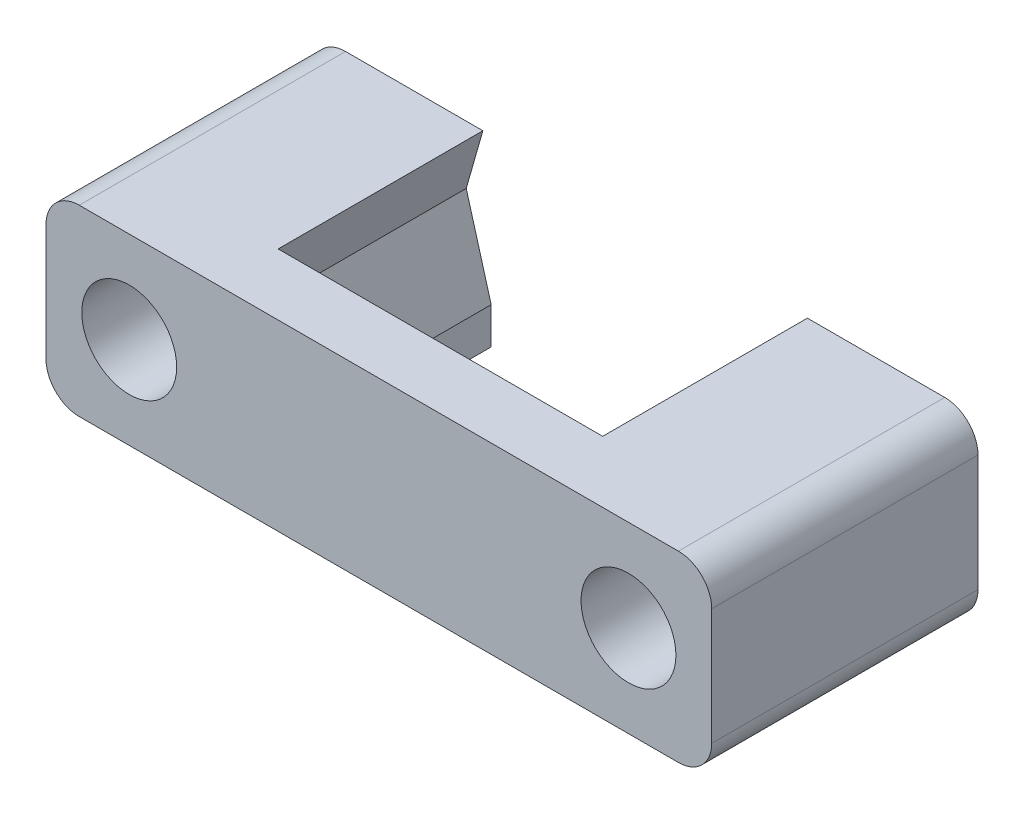
ISO-10303-21;
HEADER;
FILE_DESCRIPTION(('STEP AP214'),'2;1');
FILE_NAME('part.step','',(''),(''),'','','');
FILE_SCHEMA(('AUTOMOTIVE_DESIGN { 1 0 10303 214 1 1 1 1 }'));
ENDSEC;
DATA;
#1=APPLICATION_CONTEXT('core data for automotive mechanical design processes');
#2=APPLICATION_PROTOCOL_DEFINITION('international standard','automotive_design',2000,#1);
#3=PRODUCT_CONTEXT('',#1,'mechanical');
#4=PRODUCT('Part','Part','',(#3));
#5=PRODUCT_RELATED_PRODUCT_CATEGORY('part','',(#4));
#6=PRODUCT_DEFINITION_FORMATION('','',#4);
#7=PRODUCT_DEFINITION_CONTEXT('part definition',#1,'design');
#8=PRODUCT_DEFINITION('design','',#6,#7);
#9=PRODUCT_DEFINITION_SHAPE('','',#8);
#10=(LENGTH_UNIT() NAMED_UNIT(*) SI_UNIT(.MILLI.,.METRE.));
#11=(NAMED_UNIT(*) PLANE_ANGLE_UNIT() SI_UNIT($,.RADIAN.));
#12=(NAMED_UNIT(*) SI_UNIT($,.STERADIAN.) SOLID_ANGLE_UNIT());
#13=UNCERTAINTY_MEASURE_WITH_UNIT(LENGTH_MEASURE(1.E-05),#10,'distance_accuracy_value','');
#14=(GEOMETRIC_REPRESENTATION_CONTEXT(3) GLOBAL_UNCERTAINTY_ASSIGNED_CONTEXT((#13)) GLOBAL_UNIT_ASSIGNED_CONTEXT((#10,
#11,#12)) REPRESENTATION_CONTEXT('',''));
#15=CARTESIAN_POINT('',(0.,0.,0.));
#16=DIRECTION('',(0.,0.,1.));
#17=DIRECTION('',(1.,0.,0.));
#18=AXIS2_PLACEMENT_3D('',#15,#16,#17);
#19=CARTESIAN_POINT('',(5.,5.5,14.));
#20=DIRECTION('',(0.,0.,-1.));
#21=DIRECTION('',(-1.,0.,0.));
#22=AXIS2_PLACEMENT_3D('',#19,#20,#21);
#23=CYLINDRICAL_SURFACE('',#22,1.60000000000001);
#24=CARTESIAN_POINT('',(5.,5.5,9.));
#25=DIRECTION('',(0.,0.,1.));
#26=DIRECTION('',(1.,0.,0.));
#27=AXIS2_PLACEMENT_3D('',#24,#25,#26);
#28=CIRCLE('',#27,1.60000000000001);
#29=CARTESIAN_POINT('',(6.6,5.5,9.));
#30=VERTEX_POINT('',#29);
#31=EDGE_CURVE('E255',#30,#30,#28,.T.);
#32=ORIENTED_EDGE('',*,*,#31,.T.);
#33=EDGE_LOOP('',(#32));
#34=FACE_BOUND('',#33,.T.);
#35=CARTESIAN_POINT('',(5.,5.5,-2.));
#36=DIRECTION('',(0.,0.,-1.));
#37=DIRECTION('',(-1.,0.,0.));
#38=AXIS2_PLACEMENT_3D('',#35,#36,#37);
#39=CIRCLE('',#38,1.60000000000001);
#40=CARTESIAN_POINT('',(3.39999999999999,5.5,-2.));
#41=VERTEX_POINT('',#40);
#42=EDGE_CURVE('E172',#41,#41,#39,.T.);
#43=ORIENTED_EDGE('',*,*,#42,.T.);
#44=EDGE_LOOP('',(#43));
#45=FACE_BOUND('',#44,.T.);
#46=ADVANCED_FACE('F44',(#34,#45),#23,.F.);
#47=CARTESIAN_POINT('',(35.,5.5,14.));
#48=DIRECTION('',(0.,0.,-1.));
#49=DIRECTION('',(-1.,0.,0.));
#50=AXIS2_PLACEMENT_3D('',#47,#48,#49);
#51=CYLINDRICAL_SURFACE('',#50,1.60000000000001);
#52=CARTESIAN_POINT('',(35.,5.5,9.));
#53=DIRECTION('',(0.,0.,1.));
#54=DIRECTION('',(1.,0.,0.));
#55=AXIS2_PLACEMENT_3D('',#52,#53,#54);
#56=CIRCLE('',#55,1.60000000000001);
#57=CARTESIAN_POINT('',(36.6,5.5,9.));
#58=VERTEX_POINT('',#57);
#59=EDGE_CURVE('E240',#58,#58,#56,.T.);
#60=ORIENTED_EDGE('',*,*,#59,.T.);
#61=EDGE_LOOP('',(#60));
#62=FACE_BOUND('',#61,.T.);
#63=CARTESIAN_POINT('',(35.,5.5,-2.));
#64=DIRECTION('',(0.,0.,-1.));
#65=DIRECTION('',(-1.,0.,0.));
#66=AXIS2_PLACEMENT_3D('',#63,#64,#65);
#67=CIRCLE('',#66,1.60000000000001);
#68=CARTESIAN_POINT('',(33.4,5.5,-2.));
#69=VERTEX_POINT('',#68);
#70=EDGE_CURVE('E230',#69,#69,#67,.T.);
#71=ORIENTED_EDGE('',*,*,#70,.T.);
#72=EDGE_LOOP('',(#71));
#73=FACE_BOUND('',#72,.T.);
#74=ADVANCED_FACE('F428',(#62,#73),#51,.F.);
#75=CARTESIAN_POINT('',(0.,0.,14.));
#76=DIRECTION('',(0.,1.,0.));
#77=DIRECTION('',(0.,0.,1.));
#78=AXIS2_PLACEMENT_3D('',#75,#76,#77);
#79=PLANE('',#78);
#80=DIRECTION('',(1.,0.,0.));
#81=VECTOR('',#80,1.);
#82=CARTESIAN_POINT('',(0.,0.,14.));
#83=LINE('',#82,#81);
#84=CARTESIAN_POINT('',(2.,0.,14.));
#85=VERTEX_POINT('',#84);
#86=CARTESIAN_POINT('',(38.,0.,14.));
#87=VERTEX_POINT('',#86);
#88=EDGE_CURVE('E301',#85,#87,#83,.T.);
#89=ORIENTED_EDGE('',*,*,#88,.F.);
#90=DIRECTION('',(0.,0.,-1.));
#91=VECTOR('',#90,1.);
#92=CARTESIAN_POINT('',(2.,0.,14.));
#93=LINE('',#92,#91);
#94=CARTESIAN_POINT('',(2.,0.,-2.));
#95=VERTEX_POINT('',#94);
#96=EDGE_CURVE('E321',#85,#95,#93,.T.);
#97=ORIENTED_EDGE('',*,*,#96,.T.);
#98=DIRECTION('',(-1.,0.,0.));
#99=VECTOR('',#98,1.);
#100=CARTESIAN_POINT('',(10.75,0.,-2.));
#101=LINE('',#100,#99);
#102=CARTESIAN_POINT('',(10.75,0.,-2.));
#103=VERTEX_POINT('',#102);
#104=EDGE_CURVE('E203',#103,#95,#101,.T.);
#105=ORIENTED_EDGE('',*,*,#104,.F.);
#106=DIRECTION('',(0.,0.,-1.));
#107=VECTOR('',#106,1.);
#108=CARTESIAN_POINT('',(10.75,0.,10.3));
#109=LINE('',#108,#107);
#110=CARTESIAN_POINT('',(10.75,0.,10.3));
#111=VERTEX_POINT('',#110);
#112=EDGE_CURVE('E284',#111,#103,#109,.T.);
#113=ORIENTED_EDGE('',*,*,#112,.F.);
#114=DIRECTION('',(-1.,0.,0.));
#115=VECTOR('',#114,1.);
#116=CARTESIAN_POINT('',(0.,0.,10.3));
#117=LINE('',#116,#115);
#118=CARTESIAN_POINT('',(29.25,0.,10.3));
#119=VERTEX_POINT('',#118);
#120=EDGE_CURVE('E263',#119,#111,#117,.T.);
#121=ORIENTED_EDGE('',*,*,#120,.F.);
#122=DIRECTION('',(0.,0.,-1.));
#123=VECTOR('',#122,1.);
#124=CARTESIAN_POINT('',(29.25,0.,10.3));
#125=LINE('',#124,#123);
#126=CARTESIAN_POINT('',(29.25,0.,-2.));
#127=VERTEX_POINT('',#126);
#128=EDGE_CURVE('E288',#119,#127,#125,.T.);
#129=ORIENTED_EDGE('',*,*,#128,.T.);
#130=DIRECTION('',(-1.,0.,0.));
#131=VECTOR('',#130,1.);
#132=CARTESIAN_POINT('',(40.,0.,-2.));
#133=LINE('',#132,#131);
#134=CARTESIAN_POINT('',(38.,0.,-2.));
#135=VERTEX_POINT('',#134);
#136=EDGE_CURVE('E206',#135,#127,#133,.T.);
#137=ORIENTED_EDGE('',*,*,#136,.F.);
#138=DIRECTION('',(0.,0.,-1.));
#139=VECTOR('',#138,1.);
#140=CARTESIAN_POINT('',(38.,0.,14.));
#141=LINE('',#140,#139);
#142=EDGE_CURVE('E312',#135,#87,#141,.F.);
#143=ORIENTED_EDGE('',*,*,#142,.T.);
#144=EDGE_LOOP('',(#89,#97,#105,#113,#121,#129,#137,#143));
#145=FACE_BOUND('',#144,.T.);
#146=ADVANCED_FACE('F371',(#145),#79,.F.);
#147=CARTESIAN_POINT('',(0.,11.,14.));
#148=DIRECTION('',(0.,-1.,0.));
#149=DIRECTION('',(1.,0.,0.));
#150=AXIS2_PLACEMENT_3D('',#147,#148,#149);
#151=PLANE('',#150);
#152=DIRECTION('',(1.,0.,0.));
#153=VECTOR('',#152,1.);
#154=CARTESIAN_POINT('',(0.,11.,-2.));
#155=LINE('',#154,#153);
#156=CARTESIAN_POINT('',(2.,11.,-2.));
#157=VERTEX_POINT('',#156);
#158=CARTESIAN_POINT('',(10.25,11.,-2.));
#159=VERTEX_POINT('',#158);
#160=EDGE_CURVE('E156',#157,#159,#155,.T.);
#161=ORIENTED_EDGE('',*,*,#160,.F.);
#162=DIRECTION('',(0.,0.,-1.));
#163=VECTOR('',#162,1.);
#164=CARTESIAN_POINT('',(2.,11.,14.));
#165=LINE('',#164,#163);
#166=CARTESIAN_POINT('',(2.,11.,14.));
#167=VERTEX_POINT('',#166);
#168=EDGE_CURVE('E355',#157,#167,#165,.F.);
#169=ORIENTED_EDGE('',*,*,#168,.T.);
#170=DIRECTION('',(-1.,0.,0.));
#171=VECTOR('',#170,1.);
#172=CARTESIAN_POINT('',(0.,11.,14.));
#173=LINE('',#172,#171);
#174=CARTESIAN_POINT('',(38.,11.,14.));
#175=VERTEX_POINT('',#174);
#176=EDGE_CURVE('E307',#175,#167,#173,.T.);
#177=ORIENTED_EDGE('',*,*,#176,.F.);
#178=DIRECTION('',(0.,0.,-1.));
#179=VECTOR('',#178,1.);
#180=CARTESIAN_POINT('',(38.,11.,14.));
#181=LINE('',#180,#179);
#182=CARTESIAN_POINT('',(38.,11.,-2.));
#183=VERTEX_POINT('',#182);
#184=EDGE_CURVE('E350',#175,#183,#181,.T.);
#185=ORIENTED_EDGE('',*,*,#184,.T.);
#186=DIRECTION('',(1.,0.,0.));
#187=VECTOR('',#186,1.);
#188=CARTESIAN_POINT('',(29.75,11.,-2.));
#189=LINE('',#188,#187);
#190=CARTESIAN_POINT('',(29.75,11.,-2.));
#191=VERTEX_POINT('',#190);
#192=EDGE_CURVE('E213',#191,#183,#189,.T.);
#193=ORIENTED_EDGE('',*,*,#192,.F.);
#194=DIRECTION('',(0.,0.,-1.));
#195=VECTOR('',#194,1.);
#196=CARTESIAN_POINT('',(29.75,11.,10.3));
#197=LINE('',#196,#195);
#198=CARTESIAN_POINT('',(29.75,11.,10.3));
#199=VERTEX_POINT('',#198);
#200=EDGE_CURVE('E279',#199,#191,#197,.T.);
#201=ORIENTED_EDGE('',*,*,#200,.F.);
#202=DIRECTION('',(1.,0.,0.));
#203=VECTOR('',#202,1.);
#204=CARTESIAN_POINT('',(0.,11.,10.3));
#205=LINE('',#204,#203);
#206=CARTESIAN_POINT('',(10.25,11.,10.3));
#207=VERTEX_POINT('',#206);
#208=EDGE_CURVE('E185',#207,#199,#205,.T.);
#209=ORIENTED_EDGE('',*,*,#208,.F.);
#210=DIRECTION('',(0.,0.,-1.));
#211=VECTOR('',#210,1.);
#212=CARTESIAN_POINT('',(10.25,11.,10.3));
#213=LINE('',#212,#211);
#214=EDGE_CURVE('E178',#207,#159,#213,.T.);
#215=ORIENTED_EDGE('',*,*,#214,.T.);
#216=EDGE_LOOP('',(#161,#169,#177,#185,#193,#201,#209,#215));
#217=FACE_BOUND('',#216,.T.);
#218=ADVANCED_FACE('F177',(#217),#151,.F.);
#219=CARTESIAN_POINT('',(0.,0.,14.));
#220=DIRECTION('',(0.,0.,-1.));
#221=DIRECTION('',(-1.,0.,0.));
#222=AXIS2_PLACEMENT_3D('',#219,#220,#221);
#223=PLANE('',#222);
#224=CARTESIAN_POINT('',(5.,5.5,14.));
#225=DIRECTION('',(0.,0.,1.));
#226=DIRECTION('',(1.,0.,0.));
#227=AXIS2_PLACEMENT_3D('',#224,#225,#226);
#228=CIRCLE('',#227,2.85);
#229=CARTESIAN_POINT('',(7.85,5.5,14.));
#230=VERTEX_POINT('',#229);
#231=EDGE_CURVE('E238',#230,#230,#228,.T.);
#232=ORIENTED_EDGE('',*,*,#231,.F.);
#233=EDGE_LOOP('',(#232));
#234=FACE_BOUND('',#233,.T.);
#235=CARTESIAN_POINT('',(35.,5.5,14.));
#236=DIRECTION('',(0.,0.,1.));
#237=DIRECTION('',(1.,0.,0.));
#238=AXIS2_PLACEMENT_3D('',#235,#236,#237);
#239=CIRCLE('',#238,2.85);
#240=CARTESIAN_POINT('',(37.85,5.5,14.));
#241=VERTEX_POINT('',#240);
#242=EDGE_CURVE('E245',#241,#241,#239,.T.);
#243=ORIENTED_EDGE('',*,*,#242,.F.);
#244=EDGE_LOOP('',(#243));
#245=FACE_BOUND('',#244,.T.);
#246=DIRECTION('',(0.,-1.,0.));
#247=VECTOR('',#246,1.);
#248=CARTESIAN_POINT('',(0.,0.,14.));
#249=LINE('',#248,#247);
#250=CARTESIAN_POINT('',(0.,9.,14.));
#251=VERTEX_POINT('',#250);
#252=CARTESIAN_POINT('',(0.,2.,14.));
#253=VERTEX_POINT('',#252);
#254=EDGE_CURVE('E184',#251,#253,#249,.T.);
#255=ORIENTED_EDGE('',*,*,#254,.T.);
#256=CARTESIAN_POINT('',(2.,2.,14.));
#257=DIRECTION('',(0.,0.,-1.));
#258=DIRECTION('',(-1.,0.,0.));
#259=AXIS2_PLACEMENT_3D('',#256,#257,#258);
#260=CIRCLE('',#259,2.);
#261=EDGE_CURVE('E347',#253,#85,#260,.F.);
#262=ORIENTED_EDGE('',*,*,#261,.T.);
#263=ORIENTED_EDGE('',*,*,#88,.T.);
#264=CARTESIAN_POINT('',(38.,2.,14.));
#265=DIRECTION('',(0.,0.,-1.));
#266=DIRECTION('',(-1.,0.,0.));
#267=AXIS2_PLACEMENT_3D('',#264,#265,#266);
#268=CIRCLE('',#267,2.);
#269=CARTESIAN_POINT('',(40.,2.,14.));
#270=VERTEX_POINT('',#269);
#271=EDGE_CURVE('E336',#87,#270,#268,.F.);
#272=ORIENTED_EDGE('',*,*,#271,.T.);
#273=DIRECTION('',(0.,1.,0.));
#274=VECTOR('',#273,1.);
#275=CARTESIAN_POINT('',(40.,0.,14.));
#276=LINE('',#275,#274);
#277=CARTESIAN_POINT('',(40.,9.,14.));
#278=VERTEX_POINT('',#277);
#279=EDGE_CURVE('E304',#270,#278,#276,.T.);
#280=ORIENTED_EDGE('',*,*,#279,.T.);
#281=CARTESIAN_POINT('',(38.,9.,14.));
#282=DIRECTION('',(0.,0.,-1.));
#283=DIRECTION('',(-1.,0.,0.));
#284=AXIS2_PLACEMENT_3D('',#281,#282,#283);
#285=CIRCLE('',#284,2.);
#286=EDGE_CURVE('E344',#278,#175,#285,.F.);
#287=ORIENTED_EDGE('',*,*,#286,.T.);
#288=ORIENTED_EDGE('',*,*,#176,.T.);
#289=CARTESIAN_POINT('',(2.,9.,14.));
#290=DIRECTION('',(0.,0.,-1.));
#291=DIRECTION('',(-1.,0.,0.));
#292=AXIS2_PLACEMENT_3D('',#289,#290,#291);
#293=CIRCLE('',#292,2.);
#294=EDGE_CURVE('E343',#167,#251,#293,.F.);
#295=ORIENTED_EDGE('',*,*,#294,.T.);
#296=EDGE_LOOP('',(#255,#262,#263,#272,#280,#287,#288,#295));
#297=FACE_BOUND('',#296,.T.);
#298=ADVANCED_FACE('F374',(#234,#245,#297),#223,.F.);
#299=CARTESIAN_POINT('',(0.,0.,14.));
#300=DIRECTION('',(1.,0.,0.));
#301=DIRECTION('',(0.,0.,-1.));
#302=AXIS2_PLACEMENT_3D('',#299,#300,#301);
#303=PLANE('',#302);
#304=DIRECTION('',(0.,1.,0.));
#305=VECTOR('',#304,1.);
#306=CARTESIAN_POINT('',(0.,0.,-2.));
#307=LINE('',#306,#305);
#308=CARTESIAN_POINT('',(0.,2.,-2.));
#309=VERTEX_POINT('',#308);
#310=CARTESIAN_POINT('',(0.,9.,-2.));
#311=VERTEX_POINT('',#310);
#312=EDGE_CURVE('E205',#309,#311,#307,.T.);
#313=ORIENTED_EDGE('',*,*,#312,.F.);
#314=DIRECTION('',(0.,0.,-1.));
#315=VECTOR('',#314,1.);
#316=CARTESIAN_POINT('',(0.,2.,14.));
#317=LINE('',#316,#315);
#318=EDGE_CURVE('E331',#309,#253,#317,.F.);
#319=ORIENTED_EDGE('',*,*,#318,.T.);
#320=ORIENTED_EDGE('',*,*,#254,.F.);
#321=DIRECTION('',(0.,0.,-1.));
#322=VECTOR('',#321,1.);
#323=CARTESIAN_POINT('',(0.,9.,14.));
#324=LINE('',#323,#322);
#325=EDGE_CURVE('E333',#251,#311,#324,.T.);
#326=ORIENTED_EDGE('',*,*,#325,.T.);
#327=EDGE_LOOP('',(#313,#319,#320,#326));
#328=FACE_BOUND('',#327,.T.);
#329=ADVANCED_FACE('F383',(#328),#303,.F.);
#330=CARTESIAN_POINT('',(40.,0.,14.));
#331=DIRECTION('',(-1.,0.,0.));
#332=DIRECTION('',(0.,0.,1.));
#333=AXIS2_PLACEMENT_3D('',#330,#331,#332);
#334=PLANE('',#333);
#335=DIRECTION('',(0.,-1.,0.));
#336=VECTOR('',#335,1.);
#337=CARTESIAN_POINT('',(40.,11.,-2.));
#338=LINE('',#337,#336);
#339=CARTESIAN_POINT('',(40.,9.,-2.));
#340=VERTEX_POINT('',#339);
#341=CARTESIAN_POINT('',(40.,2.,-2.));
#342=VERTEX_POINT('',#341);
#343=EDGE_CURVE('E214',#340,#342,#338,.T.);
#344=ORIENTED_EDGE('',*,*,#343,.F.);
#345=DIRECTION('',(0.,0.,-1.));
#346=VECTOR('',#345,1.);
#347=CARTESIAN_POINT('',(40.,9.,14.));
#348=LINE('',#347,#346);
#349=EDGE_CURVE('E11',#340,#278,#348,.F.);
#350=ORIENTED_EDGE('',*,*,#349,.T.);
#351=ORIENTED_EDGE('',*,*,#279,.F.);
#352=DIRECTION('',(0.,0.,-1.));
#353=VECTOR('',#352,1.);
#354=CARTESIAN_POINT('',(40.,2.,14.));
#355=LINE('',#354,#353);
#356=EDGE_CURVE('E53',#270,#342,#355,.T.);
#357=ORIENTED_EDGE('',*,*,#356,.T.);
#358=EDGE_LOOP('',(#344,#350,#351,#357));
#359=FACE_BOUND('',#358,.T.);
#360=ADVANCED_FACE('F361',(#359),#334,.F.);
#361=CARTESIAN_POINT('',(6.57075471698113,-1.87735849056604,10.3));
#362=DIRECTION('',(0.961523947640823,-0.274721127897378,0.));
#363=DIRECTION('',(0.274721127897378,0.961523947640823,0.));
#364=AXIS2_PLACEMENT_3D('',#361,#362,#363);
#365=PLANE('',#364);
#366=DIRECTION('',(0.,0.,-1.));
#367=VECTOR('',#366,1.);
#368=CARTESIAN_POINT('',(9.25,7.5,10.3));
#369=LINE('',#368,#367);
#370=CARTESIAN_POINT('',(9.25,7.5,10.3));
#371=VERTEX_POINT('',#370);
#372=CARTESIAN_POINT('',(9.25,7.5,-2.));
#373=VERTEX_POINT('',#372);
#374=EDGE_CURVE('E187',#371,#373,#369,.T.);
#375=ORIENTED_EDGE('',*,*,#374,.T.);
#376=DIRECTION('',(-0.274721127897378,-0.961523947640823,0.));
#377=VECTOR('',#376,1.);
#378=CARTESIAN_POINT('',(10.25,11.,-2.));
#379=LINE('',#378,#377);
#380=EDGE_CURVE('E170',#159,#373,#379,.T.);
#381=ORIENTED_EDGE('',*,*,#380,.F.);
#382=ORIENTED_EDGE('',*,*,#214,.F.);
#383=DIRECTION('',(-0.274721127897378,-0.961523947640823,0.));
#384=VECTOR('',#383,1.);
#385=CARTESIAN_POINT('',(6.57075471698113,-1.87735849056604,10.3));
#386=LINE('',#385,#384);
#387=EDGE_CURVE('E274',#207,#371,#386,.T.);
#388=ORIENTED_EDGE('',*,*,#387,.T.);
#389=EDGE_LOOP('',(#375,#381,#382,#388));
#390=FACE_BOUND('',#389,.T.);
#391=ADVANCED_FACE('F189',(#390),#365,.T.);
#392=CARTESIAN_POINT('',(10.5292518127884,2.97997692814765,10.3));
#393=DIRECTION('',(0.962206045824366,0.272322465799348,0.));
#394=DIRECTION('',(-0.272322465799348,0.962206045824366,0.));
#395=AXIS2_PLACEMENT_3D('',#392,#393,#394);
#396=PLANE('',#395);
#397=DIRECTION('',(0.,0.,-1.));
#398=VECTOR('',#397,1.);
#399=CARTESIAN_POINT('',(10.75,2.19999999999999,10.3));
#400=LINE('',#399,#398);
#401=CARTESIAN_POINT('',(10.75,2.19999999999999,10.3));
#402=VERTEX_POINT('',#401);
#403=CARTESIAN_POINT('',(10.75,2.19999999999999,-2.));
#404=VERTEX_POINT('',#403);
#405=EDGE_CURVE('E277',#402,#404,#400,.T.);
#406=ORIENTED_EDGE('',*,*,#405,.T.);
#407=DIRECTION('',(0.272322465799348,-0.962206045824367,0.));
#408=VECTOR('',#407,1.);
#409=CARTESIAN_POINT('',(9.25,7.5,-2.));
#410=LINE('',#409,#408);
#411=EDGE_CURVE('E194',#373,#404,#410,.T.);
#412=ORIENTED_EDGE('',*,*,#411,.F.);
#413=ORIENTED_EDGE('',*,*,#374,.F.);
#414=DIRECTION('',(0.272322465799348,-0.962206045824367,0.));
#415=VECTOR('',#414,1.);
#416=CARTESIAN_POINT('',(10.5292518127884,2.97997692814765,10.3));
#417=LINE('',#416,#415);
#418=EDGE_CURVE('E272',#371,#402,#417,.T.);
#419=ORIENTED_EDGE('',*,*,#418,.T.);
#420=EDGE_LOOP('',(#406,#412,#413,#419));
#421=FACE_BOUND('',#420,.T.);
#422=ADVANCED_FACE('F409',(#421),#396,.T.);
#423=CARTESIAN_POINT('',(10.75,0.,10.3));
#424=DIRECTION('',(1.,0.,0.));
#425=DIRECTION('',(0.,0.,-1.));
#426=AXIS2_PLACEMENT_3D('',#423,#424,#425);
#427=PLANE('',#426);
#428=ORIENTED_EDGE('',*,*,#112,.T.);
#429=DIRECTION('',(0.,-1.,0.));
#430=VECTOR('',#429,1.);
#431=CARTESIAN_POINT('',(10.75,2.19999999999999,-2.));
#432=LINE('',#431,#430);
#433=EDGE_CURVE('E193',#404,#103,#432,.T.);
#434=ORIENTED_EDGE('',*,*,#433,.F.);
#435=ORIENTED_EDGE('',*,*,#405,.F.);
#436=DIRECTION('',(0.,-1.,0.));
#437=VECTOR('',#436,1.);
#438=CARTESIAN_POINT('',(10.75,0.,10.3));
#439=LINE('',#438,#437);
#440=EDGE_CURVE('E267',#402,#111,#439,.T.);
#441=ORIENTED_EDGE('',*,*,#440,.T.);
#442=EDGE_LOOP('',(#428,#434,#435,#441));
#443=FACE_BOUND('',#442,.T.);
#444=ADVANCED_FACE('F407',(#443),#427,.T.);
#445=CARTESIAN_POINT('',(29.25,0.,10.3));
#446=DIRECTION('',(1.,0.,0.));
#447=DIRECTION('',(0.,0.,-1.));
#448=AXIS2_PLACEMENT_3D('',#445,#446,#447);
#449=PLANE('',#448);
#450=DIRECTION('',(0.,0.,-1.));
#451=VECTOR('',#450,1.);
#452=CARTESIAN_POINT('',(29.25,2.19999999999999,10.3));
#453=LINE('',#452,#451);
#454=CARTESIAN_POINT('',(29.25,2.19999999999999,10.3));
#455=VERTEX_POINT('',#454);
#456=CARTESIAN_POINT('',(29.25,2.19999999999999,-2.));
#457=VERTEX_POINT('',#456);
#458=EDGE_CURVE('E286',#455,#457,#453,.T.);
#459=ORIENTED_EDGE('',*,*,#458,.T.);
#460=DIRECTION('',(0.,1.,0.));
#461=VECTOR('',#460,1.);
#462=CARTESIAN_POINT('',(29.25,2.19999999999999,-2.));
#463=LINE('',#462,#461);
#464=EDGE_CURVE('E221',#127,#457,#463,.T.);
#465=ORIENTED_EDGE('',*,*,#464,.F.);
#466=ORIENTED_EDGE('',*,*,#128,.F.);
#467=DIRECTION('',(0.,-1.,0.));
#468=VECTOR('',#467,1.);
#469=CARTESIAN_POINT('',(29.25,0.,10.3));
#470=LINE('',#469,#468);
#471=EDGE_CURVE('E257',#455,#119,#470,.T.);
#472=ORIENTED_EDGE('',*,*,#471,.F.);
#473=EDGE_LOOP('',(#459,#465,#466,#472));
#474=FACE_BOUND('',#473,.T.);
#475=ADVANCED_FACE('F413',(#474),#449,.F.);
#476=CARTESIAN_POINT('',(26.5043671720501,-7.50123599208965,10.3));
#477=DIRECTION('',(0.962206045824366,-0.272322465799349,0.));
#478=DIRECTION('',(0.272322465799349,0.962206045824366,0.));
#479=AXIS2_PLACEMENT_3D('',#476,#477,#478);
#480=PLANE('',#479);
#481=DIRECTION('',(0.,0.,-1.));
#482=VECTOR('',#481,1.);
#483=CARTESIAN_POINT('',(30.75,7.5,10.3));
#484=LINE('',#483,#482);
#485=CARTESIAN_POINT('',(30.75,7.5,10.3));
#486=VERTEX_POINT('',#485);
#487=CARTESIAN_POINT('',(30.75,7.5,-2.));
#488=VERTEX_POINT('',#487);
#489=EDGE_CURVE('E291',#486,#488,#484,.T.);
#490=ORIENTED_EDGE('',*,*,#489,.T.);
#491=DIRECTION('',(0.272322465799349,0.962206045824366,0.));
#492=VECTOR('',#491,1.);
#493=CARTESIAN_POINT('',(30.75,7.5,-2.));
#494=LINE('',#493,#492);
#495=EDGE_CURVE('E223',#457,#488,#494,.T.);
#496=ORIENTED_EDGE('',*,*,#495,.F.);
#497=ORIENTED_EDGE('',*,*,#458,.F.);
#498=DIRECTION('',(-0.272322465799349,-0.962206045824366,0.));
#499=VECTOR('',#498,1.);
#500=CARTESIAN_POINT('',(26.5043671720501,-7.50123599208965,10.3));
#501=LINE('',#500,#499);
#502=EDGE_CURVE('E259',#486,#455,#501,.T.);
#503=ORIENTED_EDGE('',*,*,#502,.F.);
#504=EDGE_LOOP('',(#490,#496,#497,#503));
#505=FACE_BOUND('',#504,.T.);
#506=ADVANCED_FACE('F418',(#505),#480,.F.);
#507=CARTESIAN_POINT('',(30.4103773584906,8.68867924528302,10.3));
#508=DIRECTION('',(0.961523947640823,0.274721127897378,0.));
#509=DIRECTION('',(-0.274721127897378,0.961523947640823,0.));
#510=AXIS2_PLACEMENT_3D('',#507,#508,#509);
#511=PLANE('',#510);
#512=ORIENTED_EDGE('',*,*,#200,.T.);
#513=DIRECTION('',(-0.274721127897378,0.961523947640823,0.));
#514=VECTOR('',#513,1.);
#515=CARTESIAN_POINT('',(30.75,7.5,-2.));
#516=LINE('',#515,#514);
#517=EDGE_CURVE('E217',#488,#191,#516,.T.);
#518=ORIENTED_EDGE('',*,*,#517,.F.);
#519=ORIENTED_EDGE('',*,*,#489,.F.);
#520=DIRECTION('',(0.274721127897378,-0.961523947640823,0.));
#521=VECTOR('',#520,1.);
#522=CARTESIAN_POINT('',(30.4103773584906,8.68867924528302,10.3));
#523=LINE('',#522,#521);
#524=EDGE_CURVE('E252',#199,#486,#523,.T.);
#525=ORIENTED_EDGE('',*,*,#524,.F.);
#526=EDGE_LOOP('',(#512,#518,#519,#525));
#527=FACE_BOUND('',#526,.T.);
#528=ADVANCED_FACE('F400',(#527),#511,.F.);
#529=CARTESIAN_POINT('',(0.,0.,10.3));
#530=DIRECTION('',(0.,0.,-1.));
#531=DIRECTION('',(-1.,0.,0.));
#532=AXIS2_PLACEMENT_3D('',#529,#530,#531);
#533=PLANE('',#532);
#534=ORIENTED_EDGE('',*,*,#208,.T.);
#535=ORIENTED_EDGE('',*,*,#524,.T.);
#536=ORIENTED_EDGE('',*,*,#502,.T.);
#537=ORIENTED_EDGE('',*,*,#471,.T.);
#538=ORIENTED_EDGE('',*,*,#120,.T.);
#539=ORIENTED_EDGE('',*,*,#440,.F.);
#540=ORIENTED_EDGE('',*,*,#418,.F.);
#541=ORIENTED_EDGE('',*,*,#387,.F.);
#542=EDGE_LOOP('',(#534,#535,#536,#537,#538,#539,#540,#541));
#543=FACE_BOUND('',#542,.T.);
#544=ADVANCED_FACE('F405',(#543),#533,.T.);
#545=CARTESIAN_POINT('',(35.,5.5,9.));
#546=DIRECTION('',(0.,0.,1.));
#547=DIRECTION('',(1.,0.,0.));
#548=AXIS2_PLACEMENT_3D('',#545,#546,#547);
#549=CYLINDRICAL_SURFACE('',#548,2.85);
#550=CARTESIAN_POINT('',(35.,5.5,9.));
#551=DIRECTION('',(0.,0.,1.));
#552=DIRECTION('',(1.,0.,0.));
#553=AXIS2_PLACEMENT_3D('',#550,#551,#552);
#554=CIRCLE('',#553,2.85);
#555=CARTESIAN_POINT('',(37.85,5.5,9.));
#556=VERTEX_POINT('',#555);
#557=EDGE_CURVE('E210',#556,#556,#554,.T.);
#558=ORIENTED_EDGE('',*,*,#557,.F.);
#559=EDGE_LOOP('',(#558));
#560=FACE_BOUND('',#559,.T.);
#561=ORIENTED_EDGE('',*,*,#242,.T.);
#562=EDGE_LOOP('',(#561));
#563=FACE_BOUND('',#562,.T.);
#564=ADVANCED_FACE('F602',(#560,#563),#549,.F.);
#565=CARTESIAN_POINT('',(35.,5.5,9.));
#566=DIRECTION('',(0.,0.,1.));
#567=DIRECTION('',(1.,0.,0.));
#568=AXIS2_PLACEMENT_3D('',#565,#566,#567);
#569=PLANE('',#568);
#570=ORIENTED_EDGE('',*,*,#59,.F.);
#571=EDGE_LOOP('',(#570));
#572=FACE_BOUND('',#571,.T.);
#573=ORIENTED_EDGE('',*,*,#557,.T.);
#574=EDGE_LOOP('',(#573));
#575=FACE_BOUND('',#574,.T.);
#576=ADVANCED_FACE('F627',(#572,#575),#569,.T.);
#577=CARTESIAN_POINT('',(5.,5.5,9.));
#578=DIRECTION('',(0.,0.,1.));
#579=DIRECTION('',(1.,0.,0.));
#580=AXIS2_PLACEMENT_3D('',#577,#578,#579);
#581=CYLINDRICAL_SURFACE('',#580,2.85);
#582=CARTESIAN_POINT('',(5.,5.5,9.));
#583=DIRECTION('',(0.,0.,1.));
#584=DIRECTION('',(1.,0.,0.));
#585=AXIS2_PLACEMENT_3D('',#582,#583,#584);
#586=CIRCLE('',#585,2.85);
#587=CARTESIAN_POINT('',(7.85,5.5,9.));
#588=VERTEX_POINT('',#587);
#589=EDGE_CURVE('E231',#588,#588,#586,.T.);
#590=ORIENTED_EDGE('',*,*,#589,.F.);
#591=EDGE_LOOP('',(#590));
#592=FACE_BOUND('',#591,.T.);
#593=ORIENTED_EDGE('',*,*,#231,.T.);
#594=EDGE_LOOP('',(#593));
#595=FACE_BOUND('',#594,.T.);
#596=ADVANCED_FACE('F637',(#592,#595),#581,.F.);
#597=CARTESIAN_POINT('',(5.,5.5,9.));
#598=DIRECTION('',(0.,0.,1.));
#599=DIRECTION('',(1.,0.,0.));
#600=AXIS2_PLACEMENT_3D('',#597,#598,#599);
#601=PLANE('',#600);
#602=ORIENTED_EDGE('',*,*,#31,.F.);
#603=EDGE_LOOP('',(#602));
#604=FACE_BOUND('',#603,.T.);
#605=ORIENTED_EDGE('',*,*,#589,.T.);
#606=EDGE_LOOP('',(#605));
#607=FACE_BOUND('',#606,.T.);
#608=ADVANCED_FACE('F493',(#604,#607),#601,.T.);
#609=CARTESIAN_POINT('',(0.,0.,-2.));
#610=DIRECTION('',(0.,0.,-1.));
#611=DIRECTION('',(-1.,0.,0.));
#612=AXIS2_PLACEMENT_3D('',#609,#610,#611);
#613=PLANE('',#612);
#614=ORIENTED_EDGE('',*,*,#192,.T.);
#615=CARTESIAN_POINT('',(38.,9.,-2.));
#616=DIRECTION('',(0.,0.,-1.));
#617=DIRECTION('',(-1.,0.,0.));
#618=AXIS2_PLACEMENT_3D('',#615,#616,#617);
#619=CIRCLE('',#618,2.);
#620=EDGE_CURVE('E68',#183,#340,#619,.T.);
#621=ORIENTED_EDGE('',*,*,#620,.T.);
#622=ORIENTED_EDGE('',*,*,#343,.T.);
#623=CARTESIAN_POINT('',(38.,2.,-2.));
#624=DIRECTION('',(0.,0.,-1.));
#625=DIRECTION('',(-1.,0.,0.));
#626=AXIS2_PLACEMENT_3D('',#623,#624,#625);
#627=CIRCLE('',#626,2.);
#628=EDGE_CURVE('E64',#342,#135,#627,.T.);
#629=ORIENTED_EDGE('',*,*,#628,.T.);
#630=ORIENTED_EDGE('',*,*,#136,.T.);
#631=ORIENTED_EDGE('',*,*,#464,.T.);
#632=ORIENTED_EDGE('',*,*,#495,.T.);
#633=ORIENTED_EDGE('',*,*,#517,.T.);
#634=EDGE_LOOP('',(#614,#621,#622,#629,#630,#631,#632,#633));
#635=FACE_BOUND('',#634,.T.);
#636=ORIENTED_EDGE('',*,*,#70,.F.);
#637=EDGE_LOOP('',(#636));
#638=FACE_BOUND('',#637,.T.);
#639=ADVANCED_FACE('F366',(#635,#638),#613,.T.);
#640=CARTESIAN_POINT('',(0.,0.,-2.));
#641=DIRECTION('',(0.,0.,-1.));
#642=DIRECTION('',(-1.,0.,0.));
#643=AXIS2_PLACEMENT_3D('',#640,#641,#642);
#644=PLANE('',#643);
#645=ORIENTED_EDGE('',*,*,#104,.T.);
#646=CARTESIAN_POINT('',(2.,2.,-2.));
#647=DIRECTION('',(0.,0.,-1.));
#648=DIRECTION('',(-1.,0.,0.));
#649=AXIS2_PLACEMENT_3D('',#646,#647,#648);
#650=CIRCLE('',#649,2.);
#651=EDGE_CURVE('E329',#95,#309,#650,.T.);
#652=ORIENTED_EDGE('',*,*,#651,.T.);
#653=ORIENTED_EDGE('',*,*,#312,.T.);
#654=CARTESIAN_POINT('',(2.,9.,-2.));
#655=DIRECTION('',(0.,0.,-1.));
#656=DIRECTION('',(-1.,0.,0.));
#657=AXIS2_PLACEMENT_3D('',#654,#655,#656);
#658=CIRCLE('',#657,2.);
#659=EDGE_CURVE('E167',#311,#157,#658,.T.);
#660=ORIENTED_EDGE('',*,*,#659,.T.);
#661=ORIENTED_EDGE('',*,*,#160,.T.);
#662=ORIENTED_EDGE('',*,*,#380,.T.);
#663=ORIENTED_EDGE('',*,*,#411,.T.);
#664=ORIENTED_EDGE('',*,*,#433,.T.);
#665=EDGE_LOOP('',(#645,#652,#653,#660,#661,#662,#663,#664));
#666=FACE_BOUND('',#665,.T.);
#667=ORIENTED_EDGE('',*,*,#42,.F.);
#668=EDGE_LOOP('',(#667));
#669=FACE_BOUND('',#668,.T.);
#670=ADVANCED_FACE('F161',(#666,#669),#644,.T.);
#671=CARTESIAN_POINT('',(2.,2.,14.));
#672=DIRECTION('',(0.,0.,-1.));
#673=DIRECTION('',(-1.,0.,0.));
#674=AXIS2_PLACEMENT_3D('',#671,#672,#673);
#675=CYLINDRICAL_SURFACE('',#674,2.);
#676=ORIENTED_EDGE('',*,*,#261,.F.);
#677=ORIENTED_EDGE('',*,*,#318,.F.);
#678=ORIENTED_EDGE('',*,*,#651,.F.);
#679=ORIENTED_EDGE('',*,*,#96,.F.);
#680=EDGE_LOOP('',(#676,#677,#678,#679));
#681=FACE_BOUND('',#680,.T.);
#682=ADVANCED_FACE('F382',(#681),#675,.T.);
#683=CARTESIAN_POINT('',(2.,9.,14.));
#684=DIRECTION('',(0.,0.,-1.));
#685=DIRECTION('',(-1.,0.,0.));
#686=AXIS2_PLACEMENT_3D('',#683,#684,#685);
#687=CYLINDRICAL_SURFACE('',#686,2.);
#688=ORIENTED_EDGE('',*,*,#294,.F.);
#689=ORIENTED_EDGE('',*,*,#168,.F.);
#690=ORIENTED_EDGE('',*,*,#659,.F.);
#691=ORIENTED_EDGE('',*,*,#325,.F.);
#692=EDGE_LOOP('',(#688,#689,#690,#691));
#693=FACE_BOUND('',#692,.T.);
#694=ADVANCED_FACE('F387',(#693),#687,.T.);
#695=CARTESIAN_POINT('',(38.,9.,14.));
#696=DIRECTION('',(0.,0.,-1.));
#697=DIRECTION('',(-1.,0.,0.));
#698=AXIS2_PLACEMENT_3D('',#695,#696,#697);
#699=CYLINDRICAL_SURFACE('',#698,2.);
#700=ORIENTED_EDGE('',*,*,#286,.F.);
#701=ORIENTED_EDGE('',*,*,#349,.F.);
#702=ORIENTED_EDGE('',*,*,#620,.F.);
#703=ORIENTED_EDGE('',*,*,#184,.F.);
#704=EDGE_LOOP('',(#700,#701,#702,#703));
#705=FACE_BOUND('',#704,.T.);
#706=ADVANCED_FACE('F393',(#705),#699,.T.);
#707=CARTESIAN_POINT('',(38.,2.,14.));
#708=DIRECTION('',(0.,0.,-1.));
#709=DIRECTION('',(-1.,0.,0.));
#710=AXIS2_PLACEMENT_3D('',#707,#708,#709);
#711=CYLINDRICAL_SURFACE('',#710,2.);
#712=ORIENTED_EDGE('',*,*,#271,.F.);
#713=ORIENTED_EDGE('',*,*,#142,.F.);
#714=ORIENTED_EDGE('',*,*,#628,.F.);
#715=ORIENTED_EDGE('',*,*,#356,.F.);
#716=EDGE_LOOP('',(#712,#713,#714,#715));
#717=FACE_BOUND('',#716,.T.);
#718=ADVANCED_FACE('F50',(#717),#711,.T.);
#719=CLOSED_SHELL('',(#46,#74,#146,#218,#298,#329,#360,#391,#422,#444,#475,#506,#528,#544,#564,
#576,#596,#608,#639,#670,#682,#694,#706,#718));
#720=MANIFOLD_SOLID_BREP('B2',#719);
#721=ADVANCED_BREP_SHAPE_REPRESENTATION('',(#18,#720),#14);
#722=SHAPE_DEFINITION_REPRESENTATION(#9,#721);
ENDSEC;
END-ISO-10303-21;
